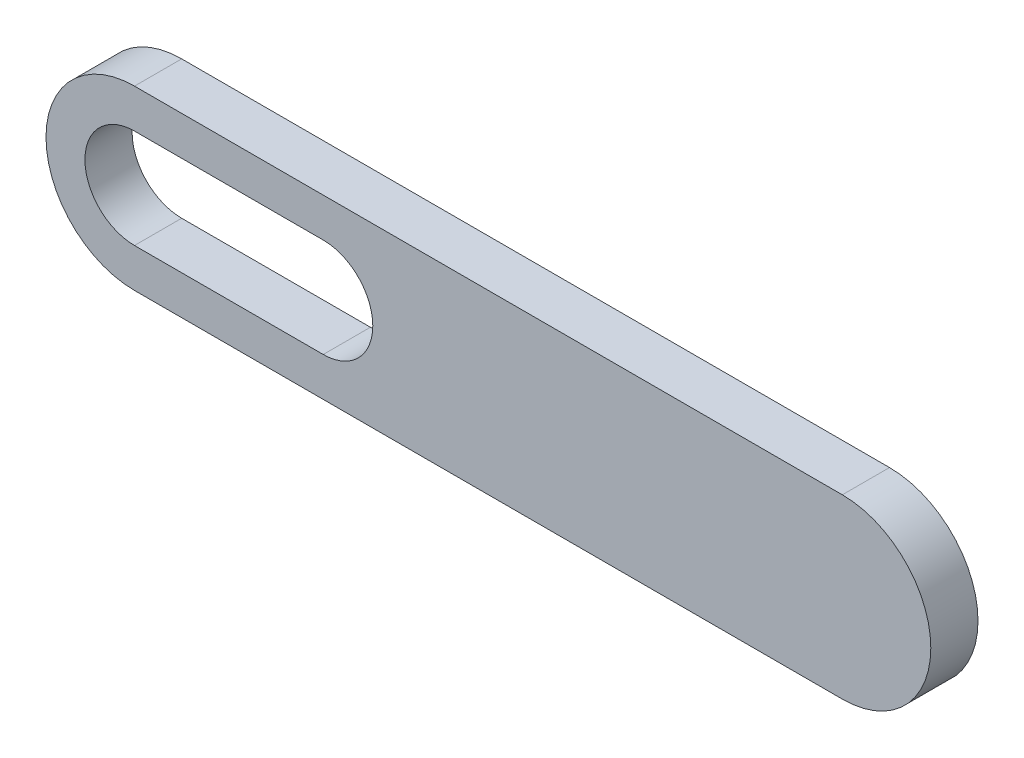
ISO-10303-21;
HEADER;
FILE_DESCRIPTION(('STEP AP214'),'2;1');
FILE_NAME('part.step','',(''),(''),'','','');
FILE_SCHEMA(('AUTOMOTIVE_DESIGN { 1 0 10303 214 1 1 1 1 }'));
ENDSEC;
DATA;
#1=APPLICATION_CONTEXT('core data for automotive mechanical design processes');
#2=APPLICATION_PROTOCOL_DEFINITION('international standard','automotive_design',2000,#1);
#3=PRODUCT_CONTEXT('',#1,'mechanical');
#4=PRODUCT('Part','Part','',(#3));
#5=PRODUCT_RELATED_PRODUCT_CATEGORY('part','',(#4));
#6=PRODUCT_DEFINITION_FORMATION('','',#4);
#7=PRODUCT_DEFINITION_CONTEXT('part definition',#1,'design');
#8=PRODUCT_DEFINITION('design','',#6,#7);
#9=PRODUCT_DEFINITION_SHAPE('','',#8);
#10=(LENGTH_UNIT() NAMED_UNIT(*) SI_UNIT(.MILLI.,.METRE.));
#11=(NAMED_UNIT(*) PLANE_ANGLE_UNIT() SI_UNIT($,.RADIAN.));
#12=(NAMED_UNIT(*) SI_UNIT($,.STERADIAN.) SOLID_ANGLE_UNIT());
#13=UNCERTAINTY_MEASURE_WITH_UNIT(LENGTH_MEASURE(1.E-05),#10,'distance_accuracy_value','');
#14=(GEOMETRIC_REPRESENTATION_CONTEXT(3) GLOBAL_UNCERTAINTY_ASSIGNED_CONTEXT((#13)) GLOBAL_UNIT_ASSIGNED_CONTEXT((#10,
#11,#12)) REPRESENTATION_CONTEXT('',''));
#15=CARTESIAN_POINT('',(0.,0.,0.));
#16=DIRECTION('',(0.,0.,1.));
#17=DIRECTION('',(1.,0.,0.));
#18=AXIS2_PLACEMENT_3D('',#15,#16,#17);
#19=CARTESIAN_POINT('',(-40.,0.,20.));
#20=DIRECTION('',(0.,0.,1.));
#21=DIRECTION('',(1.,0.,0.));
#22=AXIS2_PLACEMENT_3D('',#19,#20,#21);
#23=PLANE('',#22);
#24=CARTESIAN_POINT('',(-40.,0.,20.));
#25=DIRECTION('',(0.,0.,1.));
#26=DIRECTION('',(1.,0.,0.));
#27=AXIS2_PLACEMENT_3D('',#24,#25,#26);
#28=CIRCLE('',#27,37.5);
#29=CARTESIAN_POINT('',(-40.,37.5,20.));
#30=VERTEX_POINT('',#29);
#31=CARTESIAN_POINT('',(-40.,-37.5,20.));
#32=VERTEX_POINT('',#31);
#33=EDGE_CURVE('E143',#30,#32,#28,.T.);
#34=ORIENTED_EDGE('',*,*,#33,.T.);
#35=DIRECTION('',(1.,0.,0.));
#36=VECTOR('',#35,1.);
#37=CARTESIAN_POINT('',(-40.,-37.5,20.));
#38=LINE('',#37,#36);
#39=CARTESIAN_POINT('',(260.,-37.5,20.));
#40=VERTEX_POINT('',#39);
#41=EDGE_CURVE('E146',#32,#40,#38,.T.);
#42=ORIENTED_EDGE('',*,*,#41,.T.);
#43=CARTESIAN_POINT('',(260.,0.,20.));
#44=DIRECTION('',(0.,0.,1.));
#45=DIRECTION('',(-1.,0.,0.));
#46=AXIS2_PLACEMENT_3D('',#43,#44,#45);
#47=CIRCLE('',#46,37.5);
#48=CARTESIAN_POINT('',(260.,37.5000000000001,20.));
#49=VERTEX_POINT('',#48);
#50=EDGE_CURVE('E148',#40,#49,#47,.T.);
#51=ORIENTED_EDGE('',*,*,#50,.T.);
#52=DIRECTION('',(-1.,0.,0.));
#53=VECTOR('',#52,1.);
#54=CARTESIAN_POINT('',(-40.,37.5,20.));
#55=LINE('',#54,#53);
#56=EDGE_CURVE('E150',#49,#30,#55,.T.);
#57=ORIENTED_EDGE('',*,*,#56,.T.);
#58=EDGE_LOOP('',(#34,#42,#51,#57));
#59=FACE_BOUND('',#58,.T.);
#60=DIRECTION('',(1.,0.,0.));
#61=VECTOR('',#60,1.);
#62=CARTESIAN_POINT('',(-40.,-21.,20.));
#63=LINE('',#62,#61);
#64=CARTESIAN_POINT('',(-40.,-21.,20.));
#65=VERTEX_POINT('',#64);
#66=CARTESIAN_POINT('',(40.,-21.,20.));
#67=VERTEX_POINT('',#66);
#68=EDGE_CURVE('E125',#65,#67,#63,.T.);
#69=ORIENTED_EDGE('',*,*,#68,.F.);
#70=CARTESIAN_POINT('',(-40.,0.,20.));
#71=DIRECTION('',(0.,0.,1.));
#72=DIRECTION('',(1.,0.,0.));
#73=AXIS2_PLACEMENT_3D('',#70,#71,#72);
#74=CIRCLE('',#73,21.);
#75=CARTESIAN_POINT('',(-40.,21.,20.));
#76=VERTEX_POINT('',#75);
#77=EDGE_CURVE('E114',#76,#65,#74,.T.);
#78=ORIENTED_EDGE('',*,*,#77,.F.);
#79=DIRECTION('',(-1.,0.,0.));
#80=VECTOR('',#79,1.);
#81=CARTESIAN_POINT('',(-40.,21.,20.));
#82=LINE('',#81,#80);
#83=CARTESIAN_POINT('',(40.,21.,20.));
#84=VERTEX_POINT('',#83);
#85=EDGE_CURVE('E129',#84,#76,#82,.T.);
#86=ORIENTED_EDGE('',*,*,#85,.F.);
#87=CARTESIAN_POINT('',(40.,0.,20.));
#88=DIRECTION('',(0.,0.,1.));
#89=DIRECTION('',(-1.,0.,0.));
#90=AXIS2_PLACEMENT_3D('',#87,#88,#89);
#91=CIRCLE('',#90,21.);
#92=EDGE_CURVE('E127',#67,#84,#91,.T.);
#93=ORIENTED_EDGE('',*,*,#92,.F.);
#94=EDGE_LOOP('',(#69,#78,#86,#93));
#95=FACE_BOUND('',#94,.T.);
#96=ADVANCED_FACE('F34',(#59,#95),#23,.T.);
#97=CARTESIAN_POINT('',(-40.,0.,0.));
#98=DIRECTION('',(0.,0.,1.));
#99=DIRECTION('',(1.,0.,0.));
#100=AXIS2_PLACEMENT_3D('',#97,#98,#99);
#101=PLANE('',#100);
#102=CARTESIAN_POINT('',(-40.,0.,0.));
#103=DIRECTION('',(0.,0.,1.));
#104=DIRECTION('',(1.,0.,0.));
#105=AXIS2_PLACEMENT_3D('',#102,#103,#104);
#106=CIRCLE('',#105,37.5);
#107=CARTESIAN_POINT('',(-40.,37.5,0.));
#108=VERTEX_POINT('',#107);
#109=CARTESIAN_POINT('',(-40.,-37.5,0.));
#110=VERTEX_POINT('',#109);
#111=EDGE_CURVE('E115',#108,#110,#106,.T.);
#112=ORIENTED_EDGE('',*,*,#111,.F.);
#113=DIRECTION('',(-1.,0.,0.));
#114=VECTOR('',#113,1.);
#115=CARTESIAN_POINT('',(-40.,37.5,0.));
#116=LINE('',#115,#114);
#117=CARTESIAN_POINT('',(260.,37.5000000000001,0.));
#118=VERTEX_POINT('',#117);
#119=EDGE_CURVE('E141',#118,#108,#116,.T.);
#120=ORIENTED_EDGE('',*,*,#119,.F.);
#121=CARTESIAN_POINT('',(260.,0.,0.));
#122=DIRECTION('',(0.,0.,1.));
#123=DIRECTION('',(-1.,0.,0.));
#124=AXIS2_PLACEMENT_3D('',#121,#122,#123);
#125=CIRCLE('',#124,37.5);
#126=CARTESIAN_POINT('',(260.,-37.5,0.));
#127=VERTEX_POINT('',#126);
#128=EDGE_CURVE('E139',#127,#118,#125,.T.);
#129=ORIENTED_EDGE('',*,*,#128,.F.);
#130=DIRECTION('',(1.,0.,0.));
#131=VECTOR('',#130,1.);
#132=CARTESIAN_POINT('',(-40.,-37.5,0.));
#133=LINE('',#132,#131);
#134=EDGE_CURVE('E137',#110,#127,#133,.T.);
#135=ORIENTED_EDGE('',*,*,#134,.F.);
#136=EDGE_LOOP('',(#112,#120,#129,#135));
#137=FACE_BOUND('',#136,.T.);
#138=CARTESIAN_POINT('',(-40.,0.,0.));
#139=DIRECTION('',(0.,0.,1.));
#140=DIRECTION('',(1.,0.,0.));
#141=AXIS2_PLACEMENT_3D('',#138,#139,#140);
#142=CIRCLE('',#141,21.);
#143=CARTESIAN_POINT('',(-40.,21.,0.));
#144=VERTEX_POINT('',#143);
#145=CARTESIAN_POINT('',(-40.,-21.,0.));
#146=VERTEX_POINT('',#145);
#147=EDGE_CURVE('E57',#144,#146,#142,.T.);
#148=ORIENTED_EDGE('',*,*,#147,.T.);
#149=DIRECTION('',(1.,0.,0.));
#150=VECTOR('',#149,1.);
#151=CARTESIAN_POINT('',(-40.,-21.,0.));
#152=LINE('',#151,#150);
#153=CARTESIAN_POINT('',(40.,-21.,0.));
#154=VERTEX_POINT('',#153);
#155=EDGE_CURVE('E101',#146,#154,#152,.T.);
#156=ORIENTED_EDGE('',*,*,#155,.T.);
#157=CARTESIAN_POINT('',(40.,0.,0.));
#158=DIRECTION('',(0.,0.,1.));
#159=DIRECTION('',(-1.,0.,0.));
#160=AXIS2_PLACEMENT_3D('',#157,#158,#159);
#161=CIRCLE('',#160,21.);
#162=CARTESIAN_POINT('',(40.,21.,0.));
#163=VERTEX_POINT('',#162);
#164=EDGE_CURVE('E110',#154,#163,#161,.T.);
#165=ORIENTED_EDGE('',*,*,#164,.T.);
#166=DIRECTION('',(-1.,0.,0.));
#167=VECTOR('',#166,1.);
#168=CARTESIAN_POINT('',(-40.,21.,0.));
#169=LINE('',#168,#167);
#170=EDGE_CURVE('E119',#163,#144,#169,.T.);
#171=ORIENTED_EDGE('',*,*,#170,.T.);
#172=EDGE_LOOP('',(#148,#156,#165,#171));
#173=FACE_BOUND('',#172,.T.);
#174=ADVANCED_FACE('F118',(#137,#173),#101,.F.);
#175=CARTESIAN_POINT('',(-40.,0.,20.));
#176=DIRECTION('',(0.,0.,-1.));
#177=DIRECTION('',(-1.,0.,0.));
#178=AXIS2_PLACEMENT_3D('',#175,#176,#177);
#179=CYLINDRICAL_SURFACE('',#178,37.5);
#180=ORIENTED_EDGE('',*,*,#111,.T.);
#181=DIRECTION('',(0.,0.,-1.));
#182=VECTOR('',#181,1.);
#183=CARTESIAN_POINT('',(-40.,-37.5,20.));
#184=LINE('',#183,#182);
#185=EDGE_CURVE('E11',#32,#110,#184,.T.);
#186=ORIENTED_EDGE('',*,*,#185,.F.);
#187=ORIENTED_EDGE('',*,*,#33,.F.);
#188=DIRECTION('',(0.,0.,-1.));
#189=VECTOR('',#188,1.);
#190=CARTESIAN_POINT('',(-40.,37.5,20.));
#191=LINE('',#190,#189);
#192=EDGE_CURVE('E152',#30,#108,#191,.T.);
#193=ORIENTED_EDGE('',*,*,#192,.T.);
#194=EDGE_LOOP('',(#180,#186,#187,#193));
#195=FACE_BOUND('',#194,.T.);
#196=ADVANCED_FACE('F36',(#195),#179,.T.);
#197=CARTESIAN_POINT('',(-40.,-37.5,20.));
#198=DIRECTION('',(0.,1.,0.));
#199=DIRECTION('',(-1.,0.,0.));
#200=AXIS2_PLACEMENT_3D('',#197,#198,#199);
#201=PLANE('',#200);
#202=ORIENTED_EDGE('',*,*,#134,.T.);
#203=DIRECTION('',(0.,0.,-1.));
#204=VECTOR('',#203,1.);
#205=CARTESIAN_POINT('',(260.,-37.5,20.));
#206=LINE('',#205,#204);
#207=EDGE_CURVE('E42',#40,#127,#206,.T.);
#208=ORIENTED_EDGE('',*,*,#207,.F.);
#209=ORIENTED_EDGE('',*,*,#41,.F.);
#210=ORIENTED_EDGE('',*,*,#185,.T.);
#211=EDGE_LOOP('',(#202,#208,#209,#210));
#212=FACE_BOUND('',#211,.T.);
#213=ADVANCED_FACE('F177',(#212),#201,.F.);
#214=CARTESIAN_POINT('',(260.,0.,20.));
#215=DIRECTION('',(0.,0.,-1.));
#216=DIRECTION('',(-1.,0.,0.));
#217=AXIS2_PLACEMENT_3D('',#214,#215,#216);
#218=CYLINDRICAL_SURFACE('',#217,37.5);
#219=ORIENTED_EDGE('',*,*,#128,.T.);
#220=DIRECTION('',(0.,0.,-1.));
#221=VECTOR('',#220,1.);
#222=CARTESIAN_POINT('',(260.,37.5000000000001,20.));
#223=LINE('',#222,#221);
#224=EDGE_CURVE('E155',#49,#118,#223,.T.);
#225=ORIENTED_EDGE('',*,*,#224,.F.);
#226=ORIENTED_EDGE('',*,*,#50,.F.);
#227=ORIENTED_EDGE('',*,*,#207,.T.);
#228=EDGE_LOOP('',(#219,#225,#226,#227));
#229=FACE_BOUND('',#228,.T.);
#230=ADVANCED_FACE('F162',(#229),#218,.T.);
#231=CARTESIAN_POINT('',(-40.,37.5,20.));
#232=DIRECTION('',(0.,-1.,0.));
#233=DIRECTION('',(1.,0.,0.));
#234=AXIS2_PLACEMENT_3D('',#231,#232,#233);
#235=PLANE('',#234);
#236=ORIENTED_EDGE('',*,*,#119,.T.);
#237=ORIENTED_EDGE('',*,*,#192,.F.);
#238=ORIENTED_EDGE('',*,*,#56,.F.);
#239=ORIENTED_EDGE('',*,*,#224,.T.);
#240=EDGE_LOOP('',(#236,#237,#238,#239));
#241=FACE_BOUND('',#240,.T.);
#242=ADVANCED_FACE('F170',(#241),#235,.F.);
#243=CARTESIAN_POINT('',(-40.,0.,20.));
#244=DIRECTION('',(0.,0.,-1.));
#245=DIRECTION('',(-1.,0.,0.));
#246=AXIS2_PLACEMENT_3D('',#243,#244,#245);
#247=CYLINDRICAL_SURFACE('',#246,21.);
#248=ORIENTED_EDGE('',*,*,#147,.F.);
#249=DIRECTION('',(0.,0.,-1.));
#250=VECTOR('',#249,1.);
#251=CARTESIAN_POINT('',(-40.,21.,20.));
#252=LINE('',#251,#250);
#253=EDGE_CURVE('E131',#76,#144,#252,.T.);
#254=ORIENTED_EDGE('',*,*,#253,.F.);
#255=ORIENTED_EDGE('',*,*,#77,.T.);
#256=DIRECTION('',(0.,0.,-1.));
#257=VECTOR('',#256,1.);
#258=CARTESIAN_POINT('',(-40.,-21.,20.));
#259=LINE('',#258,#257);
#260=EDGE_CURVE('E103',#65,#146,#259,.T.);
#261=ORIENTED_EDGE('',*,*,#260,.T.);
#262=EDGE_LOOP('',(#248,#254,#255,#261));
#263=FACE_BOUND('',#262,.T.);
#264=ADVANCED_FACE('F112',(#263),#247,.F.);
#265=CARTESIAN_POINT('',(-40.,-21.,20.));
#266=DIRECTION('',(0.,1.,0.));
#267=DIRECTION('',(0.,0.,1.));
#268=AXIS2_PLACEMENT_3D('',#265,#266,#267);
#269=PLANE('',#268);
#270=ORIENTED_EDGE('',*,*,#155,.F.);
#271=ORIENTED_EDGE('',*,*,#260,.F.);
#272=ORIENTED_EDGE('',*,*,#68,.T.);
#273=DIRECTION('',(0.,0.,-1.));
#274=VECTOR('',#273,1.);
#275=CARTESIAN_POINT('',(40.,-21.,20.));
#276=LINE('',#275,#274);
#277=EDGE_CURVE('E106',#67,#154,#276,.T.);
#278=ORIENTED_EDGE('',*,*,#277,.T.);
#279=EDGE_LOOP('',(#270,#271,#272,#278));
#280=FACE_BOUND('',#279,.T.);
#281=ADVANCED_FACE('F102',(#280),#269,.T.);
#282=CARTESIAN_POINT('',(40.,0.,20.));
#283=DIRECTION('',(0.,0.,-1.));
#284=DIRECTION('',(-1.,0.,0.));
#285=AXIS2_PLACEMENT_3D('',#282,#283,#284);
#286=CYLINDRICAL_SURFACE('',#285,21.);
#287=ORIENTED_EDGE('',*,*,#164,.F.);
#288=ORIENTED_EDGE('',*,*,#277,.F.);
#289=ORIENTED_EDGE('',*,*,#92,.T.);
#290=DIRECTION('',(0.,0.,-1.));
#291=VECTOR('',#290,1.);
#292=CARTESIAN_POINT('',(40.,21.,20.));
#293=LINE('',#292,#291);
#294=EDGE_CURVE('E49',#84,#163,#293,.T.);
#295=ORIENTED_EDGE('',*,*,#294,.T.);
#296=EDGE_LOOP('',(#287,#288,#289,#295));
#297=FACE_BOUND('',#296,.T.);
#298=ADVANCED_FACE('F199',(#297),#286,.F.);
#299=CARTESIAN_POINT('',(-40.,21.,20.));
#300=DIRECTION('',(0.,-1.,0.));
#301=DIRECTION('',(0.,0.,-1.));
#302=AXIS2_PLACEMENT_3D('',#299,#300,#301);
#303=PLANE('',#302);
#304=ORIENTED_EDGE('',*,*,#170,.F.);
#305=ORIENTED_EDGE('',*,*,#294,.F.);
#306=ORIENTED_EDGE('',*,*,#85,.T.);
#307=ORIENTED_EDGE('',*,*,#253,.T.);
#308=EDGE_LOOP('',(#304,#305,#306,#307));
#309=FACE_BOUND('',#308,.T.);
#310=ADVANCED_FACE('F204',(#309),#303,.T.);
#311=CLOSED_SHELL('',(#96,#174,#196,#213,#230,#242,#264,#281,#298,#310));
#312=MANIFOLD_SOLID_BREP('B2',#311);
#313=ADVANCED_BREP_SHAPE_REPRESENTATION('',(#18,#312),#14);
#314=SHAPE_DEFINITION_REPRESENTATION(#9,#313);
ENDSEC;
END-ISO-10303-21;
